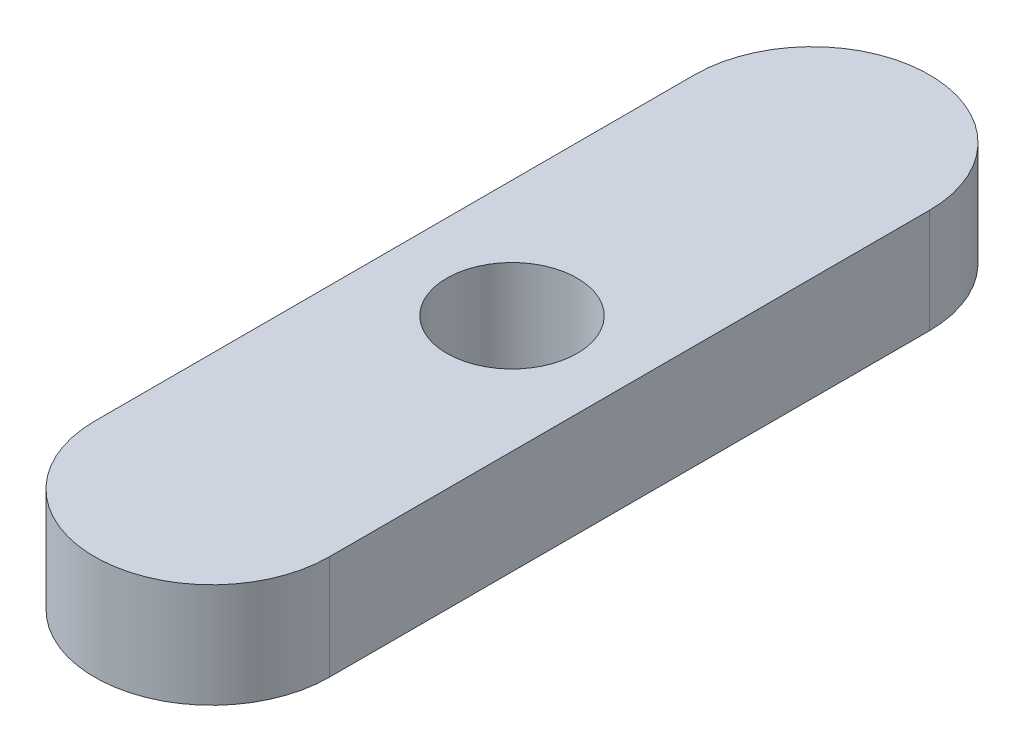
ISO-10303-21;
HEADER;
FILE_DESCRIPTION(('STEP AP214'),'2;1');
FILE_NAME('part.step','',(''),(''),'','','');
FILE_SCHEMA(('AUTOMOTIVE_DESIGN { 1 0 10303 214 1 1 1 1 }'));
ENDSEC;
DATA;
#1=APPLICATION_CONTEXT('core data for automotive mechanical design processes');
#2=APPLICATION_PROTOCOL_DEFINITION('international standard','automotive_design',2000,#1);
#3=PRODUCT_CONTEXT('',#1,'mechanical');
#4=PRODUCT('Part','Part','',(#3));
#5=PRODUCT_RELATED_PRODUCT_CATEGORY('part','',(#4));
#6=PRODUCT_DEFINITION_FORMATION('','',#4);
#7=PRODUCT_DEFINITION_CONTEXT('part definition',#1,'design');
#8=PRODUCT_DEFINITION('design','',#6,#7);
#9=PRODUCT_DEFINITION_SHAPE('','',#8);
#10=(LENGTH_UNIT() NAMED_UNIT(*) SI_UNIT(.MILLI.,.METRE.));
#11=(NAMED_UNIT(*) PLANE_ANGLE_UNIT() SI_UNIT($,.RADIAN.));
#12=(NAMED_UNIT(*) SI_UNIT($,.STERADIAN.) SOLID_ANGLE_UNIT());
#13=UNCERTAINTY_MEASURE_WITH_UNIT(LENGTH_MEASURE(1.E-05),#10,'distance_accuracy_value','');
#14=(GEOMETRIC_REPRESENTATION_CONTEXT(3) GLOBAL_UNCERTAINTY_ASSIGNED_CONTEXT((#13)) GLOBAL_UNIT_ASSIGNED_CONTEXT((#10,
#11,#12)) REPRESENTATION_CONTEXT('',''));
#15=CARTESIAN_POINT('',(0.,0.,0.));
#16=DIRECTION('',(0.,0.,1.));
#17=DIRECTION('',(1.,0.,0.));
#18=AXIS2_PLACEMENT_3D('',#15,#16,#17);
#19=CARTESIAN_POINT('',(0.,2.,0.));
#20=DIRECTION('',(0.,1.,0.));
#21=DIRECTION('',(0.,0.,1.));
#22=AXIS2_PLACEMENT_3D('',#19,#20,#21);
#23=PLANE('',#22);
#24=CARTESIAN_POINT('',(0.,2.,0.));
#25=DIRECTION('',(0.,1.,0.));
#26=DIRECTION('',(0.,0.,1.));
#27=AXIS2_PLACEMENT_3D('',#24,#25,#26);
#28=CIRCLE('',#27,2.25);
#29=CARTESIAN_POINT('',(-2.25,2.,0.));
#30=VERTEX_POINT('',#29);
#31=CARTESIAN_POINT('',(2.25,2.,0.));
#32=VERTEX_POINT('',#31);
#33=EDGE_CURVE('E87',#30,#32,#28,.T.);
#34=ORIENTED_EDGE('',*,*,#33,.T.);
#35=DIRECTION('',(0.,0.,-1.));
#36=VECTOR('',#35,1.);
#37=CARTESIAN_POINT('',(2.25,2.,-11.5));
#38=LINE('',#37,#36);
#39=CARTESIAN_POINT('',(2.25,2.,-11.5));
#40=VERTEX_POINT('',#39);
#41=EDGE_CURVE('E82',#32,#40,#38,.T.);
#42=ORIENTED_EDGE('',*,*,#41,.T.);
#43=CARTESIAN_POINT('',(0.,2.,-11.5));
#44=DIRECTION('',(0.,1.,0.));
#45=DIRECTION('',(0.,0.,1.));
#46=AXIS2_PLACEMENT_3D('',#43,#44,#45);
#47=CIRCLE('',#46,2.25);
#48=CARTESIAN_POINT('',(-2.25,2.,-11.5));
#49=VERTEX_POINT('',#48);
#50=EDGE_CURVE('E85',#40,#49,#47,.T.);
#51=ORIENTED_EDGE('',*,*,#50,.T.);
#52=DIRECTION('',(0.,0.,1.));
#53=VECTOR('',#52,1.);
#54=CARTESIAN_POINT('',(-2.25,2.,0.));
#55=LINE('',#54,#53);
#56=EDGE_CURVE('E52',#49,#30,#55,.T.);
#57=ORIENTED_EDGE('',*,*,#56,.T.);
#58=EDGE_LOOP('',(#34,#42,#51,#57));
#59=FACE_BOUND('',#58,.T.);
#60=CARTESIAN_POINT('',(0.,2.,-5.75));
#61=DIRECTION('',(0.,1.,0.));
#62=DIRECTION('',(0.,0.,1.));
#63=AXIS2_PLACEMENT_3D('',#60,#61,#62);
#64=CIRCLE('',#63,1.25);
#65=CARTESIAN_POINT('',(0.,2.,-4.5));
#66=VERTEX_POINT('',#65);
#67=EDGE_CURVE('E103',#66,#66,#64,.T.);
#68=ORIENTED_EDGE('',*,*,#67,.F.);
#69=EDGE_LOOP('',(#68));
#70=FACE_BOUND('',#69,.T.);
#71=ADVANCED_FACE('F33',(#59,#70),#23,.T.);
#72=CARTESIAN_POINT('',(0.,0.,0.));
#73=DIRECTION('',(0.,1.,0.));
#74=DIRECTION('',(0.,0.,1.));
#75=AXIS2_PLACEMENT_3D('',#72,#73,#74);
#76=PLANE('',#75);
#77=CARTESIAN_POINT('',(0.,0.,0.));
#78=DIRECTION('',(0.,1.,0.));
#79=DIRECTION('',(0.,0.,1.));
#80=AXIS2_PLACEMENT_3D('',#77,#78,#79);
#81=CIRCLE('',#80,2.25);
#82=CARTESIAN_POINT('',(-2.25,0.,0.));
#83=VERTEX_POINT('',#82);
#84=CARTESIAN_POINT('',(2.25,0.,0.));
#85=VERTEX_POINT('',#84);
#86=EDGE_CURVE('E100',#83,#85,#81,.T.);
#87=ORIENTED_EDGE('',*,*,#86,.F.);
#88=DIRECTION('',(0.,0.,1.));
#89=VECTOR('',#88,1.);
#90=CARTESIAN_POINT('',(-2.25,0.,0.));
#91=LINE('',#90,#89);
#92=CARTESIAN_POINT('',(-2.25,0.,-11.5));
#93=VERTEX_POINT('',#92);
#94=EDGE_CURVE('E75',#93,#83,#91,.T.);
#95=ORIENTED_EDGE('',*,*,#94,.F.);
#96=CARTESIAN_POINT('',(0.,0.,-11.5));
#97=DIRECTION('',(0.,1.,0.));
#98=DIRECTION('',(0.,0.,1.));
#99=AXIS2_PLACEMENT_3D('',#96,#97,#98);
#100=CIRCLE('',#99,2.25);
#101=CARTESIAN_POINT('',(2.25,0.,-11.5));
#102=VERTEX_POINT('',#101);
#103=EDGE_CURVE('E69',#102,#93,#100,.T.);
#104=ORIENTED_EDGE('',*,*,#103,.F.);
#105=DIRECTION('',(0.,0.,-1.));
#106=VECTOR('',#105,1.);
#107=CARTESIAN_POINT('',(2.25,0.,-11.5));
#108=LINE('',#107,#106);
#109=EDGE_CURVE('E91',#85,#102,#108,.T.);
#110=ORIENTED_EDGE('',*,*,#109,.F.);
#111=EDGE_LOOP('',(#87,#95,#104,#110));
#112=FACE_BOUND('',#111,.T.);
#113=CARTESIAN_POINT('',(0.,0.,-5.75));
#114=DIRECTION('',(0.,1.,0.));
#115=DIRECTION('',(0.,0.,1.));
#116=AXIS2_PLACEMENT_3D('',#113,#114,#115);
#117=CIRCLE('',#116,1.25);
#118=CARTESIAN_POINT('',(0.,0.,-4.5));
#119=VERTEX_POINT('',#118);
#120=EDGE_CURVE('E37',#119,#119,#117,.T.);
#121=ORIENTED_EDGE('',*,*,#120,.T.);
#122=EDGE_LOOP('',(#121));
#123=FACE_BOUND('',#122,.T.);
#124=ADVANCED_FACE('F114',(#112,#123),#76,.F.);
#125=CARTESIAN_POINT('',(0.,2.,0.));
#126=DIRECTION('',(0.,-1.,0.));
#127=DIRECTION('',(0.,0.,-1.));
#128=AXIS2_PLACEMENT_3D('',#125,#126,#127);
#129=CYLINDRICAL_SURFACE('',#128,2.25);
#130=ORIENTED_EDGE('',*,*,#86,.T.);
#131=DIRECTION('',(0.,-1.,0.));
#132=VECTOR('',#131,1.);
#133=CARTESIAN_POINT('',(2.25,2.,0.));
#134=LINE('',#133,#132);
#135=EDGE_CURVE('E12',#32,#85,#134,.T.);
#136=ORIENTED_EDGE('',*,*,#135,.F.);
#137=ORIENTED_EDGE('',*,*,#33,.F.);
#138=DIRECTION('',(0.,-1.,0.));
#139=VECTOR('',#138,1.);
#140=CARTESIAN_POINT('',(-2.25,2.,0.));
#141=LINE('',#140,#139);
#142=EDGE_CURVE('E96',#30,#83,#141,.T.);
#143=ORIENTED_EDGE('',*,*,#142,.T.);
#144=EDGE_LOOP('',(#130,#136,#137,#143));
#145=FACE_BOUND('',#144,.T.);
#146=ADVANCED_FACE('F127',(#145),#129,.T.);
#147=CARTESIAN_POINT('',(2.25,2.,-11.5));
#148=DIRECTION('',(-1.,0.,0.));
#149=DIRECTION('',(0.,0.,1.));
#150=AXIS2_PLACEMENT_3D('',#147,#148,#149);
#151=PLANE('',#150);
#152=ORIENTED_EDGE('',*,*,#109,.T.);
#153=DIRECTION('',(0.,-1.,0.));
#154=VECTOR('',#153,1.);
#155=CARTESIAN_POINT('',(2.25,2.,-11.5));
#156=LINE('',#155,#154);
#157=EDGE_CURVE('E43',#40,#102,#156,.T.);
#158=ORIENTED_EDGE('',*,*,#157,.F.);
#159=ORIENTED_EDGE('',*,*,#41,.F.);
#160=ORIENTED_EDGE('',*,*,#135,.T.);
#161=EDGE_LOOP('',(#152,#158,#159,#160));
#162=FACE_BOUND('',#161,.T.);
#163=ADVANCED_FACE('F90',(#162),#151,.F.);
#164=CARTESIAN_POINT('',(0.,2.,-11.5));
#165=DIRECTION('',(0.,-1.,0.));
#166=DIRECTION('',(0.,0.,-1.));
#167=AXIS2_PLACEMENT_3D('',#164,#165,#166);
#168=CYLINDRICAL_SURFACE('',#167,2.25);
#169=ORIENTED_EDGE('',*,*,#103,.T.);
#170=DIRECTION('',(0.,-1.,0.));
#171=VECTOR('',#170,1.);
#172=CARTESIAN_POINT('',(-2.25,2.,-11.5));
#173=LINE('',#172,#171);
#174=EDGE_CURVE('E92',#49,#93,#173,.T.);
#175=ORIENTED_EDGE('',*,*,#174,.F.);
#176=ORIENTED_EDGE('',*,*,#50,.F.);
#177=ORIENTED_EDGE('',*,*,#157,.T.);
#178=EDGE_LOOP('',(#169,#175,#176,#177));
#179=FACE_BOUND('',#178,.T.);
#180=ADVANCED_FACE('F94',(#179),#168,.T.);
#181=CARTESIAN_POINT('',(-2.25,2.,0.));
#182=DIRECTION('',(1.,0.,0.));
#183=DIRECTION('',(0.,0.,-1.));
#184=AXIS2_PLACEMENT_3D('',#181,#182,#183);
#185=PLANE('',#184);
#186=ORIENTED_EDGE('',*,*,#94,.T.);
#187=ORIENTED_EDGE('',*,*,#142,.F.);
#188=ORIENTED_EDGE('',*,*,#56,.F.);
#189=ORIENTED_EDGE('',*,*,#174,.T.);
#190=EDGE_LOOP('',(#186,#187,#188,#189));
#191=FACE_BOUND('',#190,.T.);
#192=ADVANCED_FACE('F117',(#191),#185,.F.);
#193=CARTESIAN_POINT('',(0.,2.,-5.75));
#194=DIRECTION('',(0.,-1.,0.));
#195=DIRECTION('',(0.,0.,-1.));
#196=AXIS2_PLACEMENT_3D('',#193,#194,#195);
#197=CYLINDRICAL_SURFACE('',#196,1.25);
#198=ORIENTED_EDGE('',*,*,#67,.T.);
#199=EDGE_LOOP('',(#198));
#200=FACE_BOUND('',#199,.T.);
#201=ORIENTED_EDGE('',*,*,#120,.F.);
#202=EDGE_LOOP('',(#201));
#203=FACE_BOUND('',#202,.T.);
#204=ADVANCED_FACE('F35',(#200,#203),#197,.F.);
#205=CLOSED_SHELL('',(#71,#124,#146,#163,#180,#192,#204));
#206=MANIFOLD_SOLID_BREP('B2',#205);
#207=ADVANCED_BREP_SHAPE_REPRESENTATION('',(#18,#206),#14);
#208=SHAPE_DEFINITION_REPRESENTATION(#9,#207);
ENDSEC;
END-ISO-10303-21;
